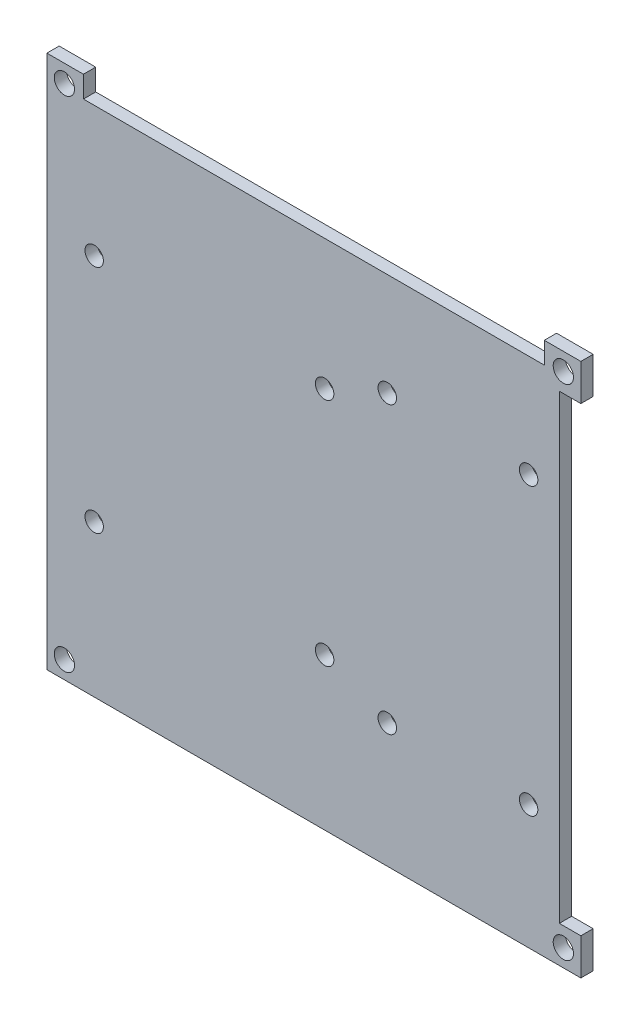
ISO-10303-21;
HEADER;
FILE_DESCRIPTION(('STEP AP214'),'2;1');
FILE_NAME('part.step','',(''),(''),'','','');
FILE_SCHEMA(('AUTOMOTIVE_DESIGN { 1 0 10303 214 1 1 1 1 }'));
ENDSEC;
DATA;
#1=APPLICATION_CONTEXT('core data for automotive mechanical design processes');
#2=APPLICATION_PROTOCOL_DEFINITION('international standard','automotive_design',2000,#1);
#3=PRODUCT_CONTEXT('',#1,'mechanical');
#4=PRODUCT('Part','Part','',(#3));
#5=PRODUCT_RELATED_PRODUCT_CATEGORY('part','',(#4));
#6=PRODUCT_DEFINITION_FORMATION('','',#4);
#7=PRODUCT_DEFINITION_CONTEXT('part definition',#1,'design');
#8=PRODUCT_DEFINITION('design','',#6,#7);
#9=PRODUCT_DEFINITION_SHAPE('','',#8);
#10=(LENGTH_UNIT() NAMED_UNIT(*) SI_UNIT(.MILLI.,.METRE.));
#11=(NAMED_UNIT(*) PLANE_ANGLE_UNIT() SI_UNIT($,.RADIAN.));
#12=(NAMED_UNIT(*) SI_UNIT($,.STERADIAN.) SOLID_ANGLE_UNIT());
#13=UNCERTAINTY_MEASURE_WITH_UNIT(LENGTH_MEASURE(1.E-05),#10,'distance_accuracy_value','');
#14=(GEOMETRIC_REPRESENTATION_CONTEXT(3) GLOBAL_UNCERTAINTY_ASSIGNED_CONTEXT((#13)) GLOBAL_UNIT_ASSIGNED_CONTEXT((#10,
#11,#12)) REPRESENTATION_CONTEXT('',''));
#15=CARTESIAN_POINT('',(0.,0.,0.));
#16=DIRECTION('',(0.,0.,1.));
#17=DIRECTION('',(1.,0.,0.));
#18=AXIS2_PLACEMENT_3D('',#15,#16,#17);
#19=CARTESIAN_POINT('',(0.,0.,2.));
#20=DIRECTION('',(-1.,0.,0.));
#21=DIRECTION('',(0.,0.,1.));
#22=AXIS2_PLACEMENT_3D('',#19,#20,#21);
#23=PLANE('',#22);
#24=DIRECTION('',(0.,0.,1.));
#25=VECTOR('',#24,1.);
#26=CARTESIAN_POINT('',(0.,80.95,0.));
#27=LINE('',#26,#25);
#28=CARTESIAN_POINT('',(0.,80.95,0.));
#29=VERTEX_POINT('',#28);
#30=CARTESIAN_POINT('',(0.,80.95,2.));
#31=VERTEX_POINT('',#30);
#32=EDGE_CURVE('E139',#29,#31,#27,.T.);
#33=ORIENTED_EDGE('',*,*,#32,.F.);
#34=DIRECTION('',(0.,1.,0.));
#35=VECTOR('',#34,1.);
#36=CARTESIAN_POINT('',(0.,0.,0.));
#37=LINE('',#36,#35);
#38=CARTESIAN_POINT('',(0.,86.9,0.));
#39=VERTEX_POINT('',#38);
#40=EDGE_CURVE('E153',#29,#39,#37,.T.);
#41=ORIENTED_EDGE('',*,*,#40,.T.);
#42=DIRECTION('',(0.,0.,-1.));
#43=VECTOR('',#42,1.);
#44=CARTESIAN_POINT('',(0.,86.9,2.));
#45=LINE('',#44,#43);
#46=CARTESIAN_POINT('',(0.,86.9,2.));
#47=VERTEX_POINT('',#46);
#48=EDGE_CURVE('E57',#47,#39,#45,.T.);
#49=ORIENTED_EDGE('',*,*,#48,.F.);
#50=DIRECTION('',(0.,1.,0.));
#51=VECTOR('',#50,1.);
#52=CARTESIAN_POINT('',(0.,0.,2.));
#53=LINE('',#52,#51);
#54=EDGE_CURVE('E154',#31,#47,#53,.T.);
#55=ORIENTED_EDGE('',*,*,#54,.F.);
#56=EDGE_LOOP('',(#33,#41,#49,#55));
#57=FACE_BOUND('',#56,.T.);
#58=ADVANCED_FACE('F50',(#57),#23,.F.);
#59=CARTESIAN_POINT('',(0.,86.9,2.));
#60=DIRECTION('',(0.,-1.,0.));
#61=DIRECTION('',(0.,0.,-1.));
#62=AXIS2_PLACEMENT_3D('',#59,#60,#61);
#63=PLANE('',#62);
#64=DIRECTION('',(0.,0.,1.));
#65=VECTOR('',#64,1.);
#66=CARTESIAN_POINT('',(-80.95,86.9,0.));
#67=LINE('',#66,#65);
#68=CARTESIAN_POINT('',(-80.95,86.9,0.));
#69=VERTEX_POINT('',#68);
#70=CARTESIAN_POINT('',(-80.95,86.9,2.));
#71=VERTEX_POINT('',#70);
#72=EDGE_CURVE('E262',#69,#71,#67,.T.);
#73=ORIENTED_EDGE('',*,*,#72,.F.);
#74=DIRECTION('',(-1.,0.,0.));
#75=VECTOR('',#74,1.);
#76=CARTESIAN_POINT('',(0.,86.9,0.));
#77=LINE('',#76,#75);
#78=CARTESIAN_POINT('',(-86.9,86.9,0.));
#79=VERTEX_POINT('',#78);
#80=EDGE_CURVE('E164',#69,#79,#77,.T.);
#81=ORIENTED_EDGE('',*,*,#80,.T.);
#82=DIRECTION('',(0.,0.,-1.));
#83=VECTOR('',#82,1.);
#84=CARTESIAN_POINT('',(-86.9,86.9,2.));
#85=LINE('',#84,#83);
#86=CARTESIAN_POINT('',(-86.9,86.9,2.));
#87=VERTEX_POINT('',#86);
#88=EDGE_CURVE('E168',#87,#79,#85,.T.);
#89=ORIENTED_EDGE('',*,*,#88,.F.);
#90=DIRECTION('',(-1.,0.,0.));
#91=VECTOR('',#90,1.);
#92=CARTESIAN_POINT('',(0.,86.9,2.));
#93=LINE('',#92,#91);
#94=EDGE_CURVE('E248',#71,#87,#93,.T.);
#95=ORIENTED_EDGE('',*,*,#94,.F.);
#96=EDGE_LOOP('',(#73,#81,#89,#95));
#97=FACE_BOUND('',#96,.T.);
#98=ADVANCED_FACE('F265',(#97),#63,.F.);
#99=CARTESIAN_POINT('',(0.,0.,2.));
#100=DIRECTION('',(0.,0.,-1.));
#101=DIRECTION('',(-1.,0.,0.));
#102=AXIS2_PLACEMENT_3D('',#99,#100,#101);
#103=PLANE('',#102);
#104=CARTESIAN_POINT('',(-31.5,20.2,2.));
#105=DIRECTION('',(0.,0.,1.));
#106=DIRECTION('',(1.,0.,0.));
#107=AXIS2_PLACEMENT_3D('',#104,#105,#106);
#108=CIRCLE('',#107,1.5);
#109=CARTESIAN_POINT('',(-30.,20.2,2.));
#110=VERTEX_POINT('',#109);
#111=EDGE_CURVE('E292',#110,#110,#108,.T.);
#112=ORIENTED_EDGE('',*,*,#111,.F.);
#113=EDGE_LOOP('',(#112));
#114=FACE_BOUND('',#113,.T.);
#115=CARTESIAN_POINT('',(-8.5,20.2,2.));
#116=DIRECTION('',(0.,0.,1.));
#117=DIRECTION('',(1.,0.,0.));
#118=AXIS2_PLACEMENT_3D('',#115,#116,#117);
#119=CIRCLE('',#118,1.5);
#120=CARTESIAN_POINT('',(-7.,20.2,2.));
#121=VERTEX_POINT('',#120);
#122=EDGE_CURVE('E319',#121,#121,#119,.T.);
#123=ORIENTED_EDGE('',*,*,#122,.F.);
#124=EDGE_LOOP('',(#123));
#125=FACE_BOUND('',#124,.T.);
#126=CARTESIAN_POINT('',(-8.5,66.7,2.));
#127=DIRECTION('',(0.,0.,1.));
#128=DIRECTION('',(1.,0.,0.));
#129=AXIS2_PLACEMENT_3D('',#126,#127,#128);
#130=CIRCLE('',#129,1.5);
#131=CARTESIAN_POINT('',(-7.,66.7,2.));
#132=VERTEX_POINT('',#131);
#133=EDGE_CURVE('E320',#132,#132,#130,.T.);
#134=ORIENTED_EDGE('',*,*,#133,.F.);
#135=EDGE_LOOP('',(#134));
#136=FACE_BOUND('',#135,.T.);
#137=CARTESIAN_POINT('',(-31.5,66.7,2.));
#138=DIRECTION('',(0.,0.,1.));
#139=DIRECTION('',(1.,0.,0.));
#140=AXIS2_PLACEMENT_3D('',#137,#138,#139);
#141=CIRCLE('',#140,1.5);
#142=CARTESIAN_POINT('',(-30.,66.7,2.));
#143=VERTEX_POINT('',#142);
#144=EDGE_CURVE('E192',#143,#143,#141,.T.);
#145=ORIENTED_EDGE('',*,*,#144,.F.);
#146=EDGE_LOOP('',(#145));
#147=FACE_BOUND('',#146,.T.);
#148=CARTESIAN_POINT('',(-41.7,24.7,2.));
#149=DIRECTION('',(0.,0.,1.));
#150=DIRECTION('',(1.,0.,0.));
#151=AXIS2_PLACEMENT_3D('',#148,#149,#150);
#152=CIRCLE('',#151,1.5);
#153=CARTESIAN_POINT('',(-40.2,24.7,2.));
#154=VERTEX_POINT('',#153);
#155=EDGE_CURVE('E209',#154,#154,#152,.T.);
#156=ORIENTED_EDGE('',*,*,#155,.F.);
#157=EDGE_LOOP('',(#156));
#158=FACE_BOUND('',#157,.T.);
#159=CARTESIAN_POINT('',(-79.2,62.2,2.));
#160=DIRECTION('',(0.,0.,1.));
#161=DIRECTION('',(1.,0.,0.));
#162=AXIS2_PLACEMENT_3D('',#159,#160,#161);
#163=CIRCLE('',#162,1.5);
#164=CARTESIAN_POINT('',(-77.7,62.2,2.));
#165=VERTEX_POINT('',#164);
#166=EDGE_CURVE('E202',#165,#165,#163,.T.);
#167=ORIENTED_EDGE('',*,*,#166,.F.);
#168=EDGE_LOOP('',(#167));
#169=FACE_BOUND('',#168,.T.);
#170=CARTESIAN_POINT('',(-79.2,24.7,2.));
#171=DIRECTION('',(0.,0.,1.));
#172=DIRECTION('',(1.,0.,0.));
#173=AXIS2_PLACEMENT_3D('',#170,#171,#172);
#174=CIRCLE('',#173,1.5);
#175=CARTESIAN_POINT('',(-77.7,24.7,2.));
#176=VERTEX_POINT('',#175);
#177=EDGE_CURVE('E203',#176,#176,#174,.T.);
#178=ORIENTED_EDGE('',*,*,#177,.F.);
#179=EDGE_LOOP('',(#178));
#180=FACE_BOUND('',#179,.T.);
#181=CARTESIAN_POINT('',(-41.7,62.2,2.));
#182=DIRECTION('',(0.,0.,1.));
#183=DIRECTION('',(1.,0.,0.));
#184=AXIS2_PLACEMENT_3D('',#181,#182,#183);
#185=CIRCLE('',#184,1.5);
#186=CARTESIAN_POINT('',(-40.2,62.2,2.));
#187=VERTEX_POINT('',#186);
#188=EDGE_CURVE('E179',#187,#187,#185,.T.);
#189=ORIENTED_EDGE('',*,*,#188,.F.);
#190=EDGE_LOOP('',(#189));
#191=FACE_BOUND('',#190,.T.);
#192=CARTESIAN_POINT('',(-84.05,84.05,2.));
#193=DIRECTION('',(0.,0.,1.));
#194=DIRECTION('',(1.,0.,0.));
#195=AXIS2_PLACEMENT_3D('',#192,#193,#194);
#196=CIRCLE('',#195,1.65);
#197=CARTESIAN_POINT('',(-82.4,84.05,2.));
#198=VERTEX_POINT('',#197);
#199=EDGE_CURVE('E235',#198,#198,#196,.T.);
#200=ORIENTED_EDGE('',*,*,#199,.F.);
#201=EDGE_LOOP('',(#200));
#202=FACE_BOUND('',#201,.T.);
#203=CARTESIAN_POINT('',(-2.84999999999997,84.05,2.));
#204=DIRECTION('',(0.,0.,1.));
#205=DIRECTION('',(1.,0.,0.));
#206=AXIS2_PLACEMENT_3D('',#203,#204,#205);
#207=CIRCLE('',#206,1.65);
#208=CARTESIAN_POINT('',(-1.19999999999997,84.05,2.));
#209=VERTEX_POINT('',#208);
#210=EDGE_CURVE('E228',#209,#209,#207,.T.);
#211=ORIENTED_EDGE('',*,*,#210,.F.);
#212=EDGE_LOOP('',(#211));
#213=FACE_BOUND('',#212,.T.);
#214=CARTESIAN_POINT('',(-2.85,2.84999999999999,2.));
#215=DIRECTION('',(0.,0.,1.));
#216=DIRECTION('',(1.,0.,0.));
#217=AXIS2_PLACEMENT_3D('',#214,#215,#216);
#218=CIRCLE('',#217,1.65);
#219=CARTESIAN_POINT('',(-1.2,2.84999999999999,2.));
#220=VERTEX_POINT('',#219);
#221=EDGE_CURVE('E218',#220,#220,#218,.T.);
#222=ORIENTED_EDGE('',*,*,#221,.F.);
#223=EDGE_LOOP('',(#222));
#224=FACE_BOUND('',#223,.T.);
#225=CARTESIAN_POINT('',(-84.05,2.85000000000001,2.));
#226=DIRECTION('',(0.,0.,1.));
#227=DIRECTION('',(1.,0.,0.));
#228=AXIS2_PLACEMENT_3D('',#225,#226,#227);
#229=CIRCLE('',#228,1.65);
#230=CARTESIAN_POINT('',(-82.4,2.85000000000001,2.));
#231=VERTEX_POINT('',#230);
#232=EDGE_CURVE('E225',#231,#231,#229,.T.);
#233=ORIENTED_EDGE('',*,*,#232,.F.);
#234=EDGE_LOOP('',(#233));
#235=FACE_BOUND('',#234,.T.);
#236=DIRECTION('',(-1.,0.,0.));
#237=VECTOR('',#236,1.);
#238=CARTESIAN_POINT('',(0.,80.95,2.));
#239=LINE('',#238,#237);
#240=CARTESIAN_POINT('',(-3.49999999999999,80.95,2.));
#241=VERTEX_POINT('',#240);
#242=EDGE_CURVE('E286',#31,#241,#239,.T.);
#243=ORIENTED_EDGE('',*,*,#242,.F.);
#244=ORIENTED_EDGE('',*,*,#54,.T.);
#245=CARTESIAN_POINT('',(-5.95,86.9,2.));
#246=VERTEX_POINT('',#245);
#247=EDGE_CURVE('E247',#47,#246,#93,.T.);
#248=ORIENTED_EDGE('',*,*,#247,.T.);
#249=DIRECTION('',(0.,1.,0.));
#250=VECTOR('',#249,1.);
#251=CARTESIAN_POINT('',(-5.95,86.9,2.));
#252=LINE('',#251,#250);
#253=CARTESIAN_POINT('',(-5.95,83.4,2.));
#254=VERTEX_POINT('',#253);
#255=EDGE_CURVE('E303',#254,#246,#252,.T.);
#256=ORIENTED_EDGE('',*,*,#255,.F.);
#257=DIRECTION('',(1.,0.,0.));
#258=VECTOR('',#257,1.);
#259=CARTESIAN_POINT('',(-5.95,83.4,2.));
#260=LINE('',#259,#258);
#261=CARTESIAN_POINT('',(-80.95,83.4,2.));
#262=VERTEX_POINT('',#261);
#263=EDGE_CURVE('E304',#262,#254,#260,.T.);
#264=ORIENTED_EDGE('',*,*,#263,.F.);
#265=DIRECTION('',(0.,-1.,0.));
#266=VECTOR('',#265,1.);
#267=CARTESIAN_POINT('',(-80.95,86.9,2.));
#268=LINE('',#267,#266);
#269=EDGE_CURVE('E310',#71,#262,#268,.T.);
#270=ORIENTED_EDGE('',*,*,#269,.F.);
#271=ORIENTED_EDGE('',*,*,#94,.T.);
#272=DIRECTION('',(0.,1.,0.));
#273=VECTOR('',#272,1.);
#274=CARTESIAN_POINT('',(-86.9,0.,2.));
#275=LINE('',#274,#273);
#276=CARTESIAN_POINT('',(-86.9,0.,2.));
#277=VERTEX_POINT('',#276);
#278=EDGE_CURVE('E242',#277,#87,#275,.T.);
#279=ORIENTED_EDGE('',*,*,#278,.F.);
#280=DIRECTION('',(-1.,0.,0.));
#281=VECTOR('',#280,1.);
#282=CARTESIAN_POINT('',(0.,0.,2.));
#283=LINE('',#282,#281);
#284=CARTESIAN_POINT('',(0.,0.,2.));
#285=VERTEX_POINT('',#284);
#286=EDGE_CURVE('E163',#285,#277,#283,.T.);
#287=ORIENTED_EDGE('',*,*,#286,.F.);
#288=CARTESIAN_POINT('',(0.,5.95,2.));
#289=VERTEX_POINT('',#288);
#290=EDGE_CURVE('E172',#285,#289,#53,.T.);
#291=ORIENTED_EDGE('',*,*,#290,.T.);
#292=DIRECTION('',(1.,0.,0.));
#293=VECTOR('',#292,1.);
#294=CARTESIAN_POINT('',(0.,5.95,2.));
#295=LINE('',#294,#293);
#296=CARTESIAN_POINT('',(-3.49999999999998,5.95,2.));
#297=VERTEX_POINT('',#296);
#298=EDGE_CURVE('E146',#297,#289,#295,.T.);
#299=ORIENTED_EDGE('',*,*,#298,.F.);
#300=DIRECTION('',(0.,-1.,0.));
#301=VECTOR('',#300,1.);
#302=CARTESIAN_POINT('',(-3.49999999999999,80.95,2.));
#303=LINE('',#302,#301);
#304=EDGE_CURVE('E284',#241,#297,#303,.T.);
#305=ORIENTED_EDGE('',*,*,#304,.F.);
#306=EDGE_LOOP('',(#243,#244,#248,#256,#264,#270,#271,#279,#287,#291,#299,#305));
#307=FACE_BOUND('',#306,.T.);
#308=ADVANCED_FACE('F271',(#114,#125,#136,#147,#158,#169,#180,#191,#202,#213,#224,#235,#307),
#103,.F.);
#309=CARTESIAN_POINT('',(0.,0.,0.));
#310=DIRECTION('',(0.,0.,-1.));
#311=DIRECTION('',(-1.,0.,0.));
#312=AXIS2_PLACEMENT_3D('',#309,#310,#311);
#313=PLANE('',#312);
#314=CARTESIAN_POINT('',(-31.5,20.2,0.));
#315=DIRECTION('',(0.,0.,-1.));
#316=DIRECTION('',(-1.,0.,0.));
#317=AXIS2_PLACEMENT_3D('',#314,#315,#316);
#318=CIRCLE('',#317,1.5);
#319=CARTESIAN_POINT('',(-33.,20.2,0.));
#320=VERTEX_POINT('',#319);
#321=EDGE_CURVE('E51',#320,#320,#318,.T.);
#322=ORIENTED_EDGE('',*,*,#321,.F.);
#323=EDGE_LOOP('',(#322));
#324=FACE_BOUND('',#323,.T.);
#325=CARTESIAN_POINT('',(-8.5,20.2,0.));
#326=DIRECTION('',(0.,0.,-1.));
#327=DIRECTION('',(-1.,0.,0.));
#328=AXIS2_PLACEMENT_3D('',#325,#326,#327);
#329=CIRCLE('',#328,1.5);
#330=CARTESIAN_POINT('',(-10.,20.2,0.));
#331=VERTEX_POINT('',#330);
#332=EDGE_CURVE('E198',#331,#331,#329,.T.);
#333=ORIENTED_EDGE('',*,*,#332,.F.);
#334=EDGE_LOOP('',(#333));
#335=FACE_BOUND('',#334,.T.);
#336=CARTESIAN_POINT('',(-8.5,66.7,0.));
#337=DIRECTION('',(0.,0.,-1.));
#338=DIRECTION('',(-1.,0.,0.));
#339=AXIS2_PLACEMENT_3D('',#336,#337,#338);
#340=CIRCLE('',#339,1.5);
#341=CARTESIAN_POINT('',(-10.,66.7,0.));
#342=VERTEX_POINT('',#341);
#343=EDGE_CURVE('E193',#342,#342,#340,.T.);
#344=ORIENTED_EDGE('',*,*,#343,.F.);
#345=EDGE_LOOP('',(#344));
#346=FACE_BOUND('',#345,.T.);
#347=CARTESIAN_POINT('',(-31.5,66.7,0.));
#348=DIRECTION('',(0.,0.,-1.));
#349=DIRECTION('',(-1.,0.,0.));
#350=AXIS2_PLACEMENT_3D('',#347,#348,#349);
#351=CIRCLE('',#350,1.5);
#352=CARTESIAN_POINT('',(-33.,66.7,0.));
#353=VERTEX_POINT('',#352);
#354=EDGE_CURVE('E187',#353,#353,#351,.T.);
#355=ORIENTED_EDGE('',*,*,#354,.F.);
#356=EDGE_LOOP('',(#355));
#357=FACE_BOUND('',#356,.T.);
#358=CARTESIAN_POINT('',(-41.7,24.7,0.));
#359=DIRECTION('',(0.,0.,-1.));
#360=DIRECTION('',(-1.,0.,0.));
#361=AXIS2_PLACEMENT_3D('',#358,#359,#360);
#362=CIRCLE('',#361,1.5);
#363=CARTESIAN_POINT('',(-43.2,24.7,0.));
#364=VERTEX_POINT('',#363);
#365=EDGE_CURVE('E188',#364,#364,#362,.T.);
#366=ORIENTED_EDGE('',*,*,#365,.F.);
#367=EDGE_LOOP('',(#366));
#368=FACE_BOUND('',#367,.T.);
#369=CARTESIAN_POINT('',(-79.2,62.2,0.));
#370=DIRECTION('',(0.,0.,-1.));
#371=DIRECTION('',(-1.,0.,0.));
#372=AXIS2_PLACEMENT_3D('',#369,#370,#371);
#373=CIRCLE('',#372,1.5);
#374=CARTESIAN_POINT('',(-80.7,62.2,0.));
#375=VERTEX_POINT('',#374);
#376=EDGE_CURVE('E181',#375,#375,#373,.T.);
#377=ORIENTED_EDGE('',*,*,#376,.F.);
#378=EDGE_LOOP('',(#377));
#379=FACE_BOUND('',#378,.T.);
#380=CARTESIAN_POINT('',(-79.2,24.7,0.));
#381=DIRECTION('',(0.,0.,-1.));
#382=DIRECTION('',(-1.,0.,0.));
#383=AXIS2_PLACEMENT_3D('',#380,#381,#382);
#384=CIRCLE('',#383,1.5);
#385=CARTESIAN_POINT('',(-80.7,24.7,0.));
#386=VERTEX_POINT('',#385);
#387=EDGE_CURVE('E177',#386,#386,#384,.T.);
#388=ORIENTED_EDGE('',*,*,#387,.F.);
#389=EDGE_LOOP('',(#388));
#390=FACE_BOUND('',#389,.T.);
#391=CARTESIAN_POINT('',(-41.7,62.2,0.));
#392=DIRECTION('',(0.,0.,-1.));
#393=DIRECTION('',(-1.,0.,0.));
#394=AXIS2_PLACEMENT_3D('',#391,#392,#393);
#395=CIRCLE('',#394,1.5);
#396=CARTESIAN_POINT('',(-43.2,62.2,0.));
#397=VERTEX_POINT('',#396);
#398=EDGE_CURVE('E176',#397,#397,#395,.T.);
#399=ORIENTED_EDGE('',*,*,#398,.F.);
#400=EDGE_LOOP('',(#399));
#401=FACE_BOUND('',#400,.T.);
#402=CARTESIAN_POINT('',(-84.05,84.05,0.));
#403=DIRECTION('',(0.,0.,1.));
#404=DIRECTION('',(1.,0.,0.));
#405=AXIS2_PLACEMENT_3D('',#402,#403,#404);
#406=CIRCLE('',#405,1.65);
#407=CARTESIAN_POINT('',(-82.4,84.05,0.));
#408=VERTEX_POINT('',#407);
#409=EDGE_CURVE('E189',#408,#408,#406,.T.);
#410=ORIENTED_EDGE('',*,*,#409,.T.);
#411=EDGE_LOOP('',(#410));
#412=FACE_BOUND('',#411,.T.);
#413=CARTESIAN_POINT('',(-2.84999999999997,84.05,0.));
#414=DIRECTION('',(0.,0.,1.));
#415=DIRECTION('',(1.,0.,0.));
#416=AXIS2_PLACEMENT_3D('',#413,#414,#415);
#417=CIRCLE('',#416,1.65);
#418=CARTESIAN_POINT('',(-1.19999999999997,84.05,0.));
#419=VERTEX_POINT('',#418);
#420=EDGE_CURVE('E229',#419,#419,#417,.T.);
#421=ORIENTED_EDGE('',*,*,#420,.T.);
#422=EDGE_LOOP('',(#421));
#423=FACE_BOUND('',#422,.T.);
#424=CARTESIAN_POINT('',(-2.85,2.84999999999999,0.));
#425=DIRECTION('',(0.,0.,1.));
#426=DIRECTION('',(1.,0.,0.));
#427=AXIS2_PLACEMENT_3D('',#424,#425,#426);
#428=CIRCLE('',#427,1.65);
#429=CARTESIAN_POINT('',(-1.2,2.84999999999999,0.));
#430=VERTEX_POINT('',#429);
#431=EDGE_CURVE('E224',#430,#430,#428,.T.);
#432=ORIENTED_EDGE('',*,*,#431,.T.);
#433=EDGE_LOOP('',(#432));
#434=FACE_BOUND('',#433,.T.);
#435=CARTESIAN_POINT('',(-84.05,2.85000000000001,0.));
#436=DIRECTION('',(0.,0.,1.));
#437=DIRECTION('',(1.,0.,0.));
#438=AXIS2_PLACEMENT_3D('',#435,#436,#437);
#439=CIRCLE('',#438,1.65);
#440=CARTESIAN_POINT('',(-82.4,2.85000000000001,0.));
#441=VERTEX_POINT('',#440);
#442=EDGE_CURVE('E240',#441,#441,#439,.T.);
#443=ORIENTED_EDGE('',*,*,#442,.T.);
#444=EDGE_LOOP('',(#443));
#445=FACE_BOUND('',#444,.T.);
#446=DIRECTION('',(0.,-1.,0.));
#447=VECTOR('',#446,1.);
#448=CARTESIAN_POINT('',(-3.49999999999999,80.95,0.));
#449=LINE('',#448,#447);
#450=CARTESIAN_POINT('',(-3.49999999999999,80.95,0.));
#451=VERTEX_POINT('',#450);
#452=CARTESIAN_POINT('',(-3.49999999999998,5.95,0.));
#453=VERTEX_POINT('',#452);
#454=EDGE_CURVE('E150',#451,#453,#449,.T.);
#455=ORIENTED_EDGE('',*,*,#454,.T.);
#456=DIRECTION('',(1.,0.,0.));
#457=VECTOR('',#456,1.);
#458=CARTESIAN_POINT('',(0.,5.95,0.));
#459=LINE('',#458,#457);
#460=CARTESIAN_POINT('',(0.,5.95,0.));
#461=VERTEX_POINT('',#460);
#462=EDGE_CURVE('E64',#453,#461,#459,.T.);
#463=ORIENTED_EDGE('',*,*,#462,.T.);
#464=CARTESIAN_POINT('',(0.,0.,0.));
#465=VERTEX_POINT('',#464);
#466=EDGE_CURVE('E161',#465,#461,#37,.T.);
#467=ORIENTED_EDGE('',*,*,#466,.F.);
#468=DIRECTION('',(-1.,0.,0.));
#469=VECTOR('',#468,1.);
#470=CARTESIAN_POINT('',(0.,0.,0.));
#471=LINE('',#470,#469);
#472=CARTESIAN_POINT('',(-86.9,0.,0.));
#473=VERTEX_POINT('',#472);
#474=EDGE_CURVE('E238',#465,#473,#471,.T.);
#475=ORIENTED_EDGE('',*,*,#474,.T.);
#476=DIRECTION('',(0.,1.,0.));
#477=VECTOR('',#476,1.);
#478=CARTESIAN_POINT('',(-86.9,0.,0.));
#479=LINE('',#478,#477);
#480=EDGE_CURVE('E254',#473,#79,#479,.T.);
#481=ORIENTED_EDGE('',*,*,#480,.T.);
#482=ORIENTED_EDGE('',*,*,#80,.F.);
#483=DIRECTION('',(0.,-1.,0.));
#484=VECTOR('',#483,1.);
#485=CARTESIAN_POINT('',(-80.95,86.9,0.));
#486=LINE('',#485,#484);
#487=CARTESIAN_POINT('',(-80.95,83.4,0.));
#488=VERTEX_POINT('',#487);
#489=EDGE_CURVE('E308',#69,#488,#486,.T.);
#490=ORIENTED_EDGE('',*,*,#489,.T.);
#491=DIRECTION('',(1.,0.,0.));
#492=VECTOR('',#491,1.);
#493=CARTESIAN_POINT('',(-5.95,83.4,0.));
#494=LINE('',#493,#492);
#495=CARTESIAN_POINT('',(-5.95,83.4,0.));
#496=VERTEX_POINT('',#495);
#497=EDGE_CURVE('E311',#488,#496,#494,.T.);
#498=ORIENTED_EDGE('',*,*,#497,.T.);
#499=DIRECTION('',(0.,1.,0.));
#500=VECTOR('',#499,1.);
#501=CARTESIAN_POINT('',(-5.95,86.9,0.));
#502=LINE('',#501,#500);
#503=CARTESIAN_POINT('',(-5.95,86.9,0.));
#504=VERTEX_POINT('',#503);
#505=EDGE_CURVE('E75',#496,#504,#502,.T.);
#506=ORIENTED_EDGE('',*,*,#505,.T.);
#507=EDGE_CURVE('E159',#39,#504,#77,.T.);
#508=ORIENTED_EDGE('',*,*,#507,.F.);
#509=ORIENTED_EDGE('',*,*,#40,.F.);
#510=DIRECTION('',(-1.,0.,0.));
#511=VECTOR('',#510,1.);
#512=CARTESIAN_POINT('',(0.,80.95,0.));
#513=LINE('',#512,#511);
#514=EDGE_CURVE('E136',#29,#451,#513,.T.);
#515=ORIENTED_EDGE('',*,*,#514,.T.);
#516=EDGE_LOOP('',(#455,#463,#467,#475,#481,#482,#490,#498,#506,#508,#509,#515));
#517=FACE_BOUND('',#516,.T.);
#518=ADVANCED_FACE('F158',(#324,#335,#346,#357,#368,#379,#390,#401,#412,#423,#434,#445,#517),
#313,.T.);
#519=CARTESIAN_POINT('',(0.,0.,2.));
#520=DIRECTION('',(0.,-1.,0.));
#521=DIRECTION('',(0.,0.,-1.));
#522=AXIS2_PLACEMENT_3D('',#519,#520,#521);
#523=PLANE('',#522);
#524=ORIENTED_EDGE('',*,*,#474,.F.);
#525=DIRECTION('',(0.,0.,-1.));
#526=VECTOR('',#525,1.);
#527=CARTESIAN_POINT('',(0.,0.,2.));
#528=LINE('',#527,#526);
#529=EDGE_CURVE('E11',#285,#465,#528,.T.);
#530=ORIENTED_EDGE('',*,*,#529,.F.);
#531=ORIENTED_EDGE('',*,*,#286,.T.);
#532=DIRECTION('',(0.,0.,-1.));
#533=VECTOR('',#532,1.);
#534=CARTESIAN_POINT('',(-86.9,0.,2.));
#535=LINE('',#534,#533);
#536=EDGE_CURVE('E171',#277,#473,#535,.T.);
#537=ORIENTED_EDGE('',*,*,#536,.T.);
#538=EDGE_LOOP('',(#524,#530,#531,#537));
#539=FACE_BOUND('',#538,.T.);
#540=ADVANCED_FACE('F47',(#539),#523,.T.);
#541=ORIENTED_EDGE('',*,*,#466,.T.);
#542=DIRECTION('',(0.,0.,1.));
#543=VECTOR('',#542,1.);
#544=CARTESIAN_POINT('',(0.,5.95,0.));
#545=LINE('',#544,#543);
#546=EDGE_CURVE('E278',#461,#289,#545,.T.);
#547=ORIENTED_EDGE('',*,*,#546,.T.);
#548=ORIENTED_EDGE('',*,*,#290,.F.);
#549=ORIENTED_EDGE('',*,*,#529,.T.);
#550=EDGE_LOOP('',(#541,#547,#548,#549));
#551=FACE_BOUND('',#550,.T.);
#552=ADVANCED_FACE('F276',(#551),#23,.F.);
#553=ORIENTED_EDGE('',*,*,#507,.T.);
#554=DIRECTION('',(0.,0.,1.));
#555=VECTOR('',#554,1.);
#556=CARTESIAN_POINT('',(-5.95,86.9,0.));
#557=LINE('',#556,#555);
#558=EDGE_CURVE('E297',#504,#246,#557,.T.);
#559=ORIENTED_EDGE('',*,*,#558,.T.);
#560=ORIENTED_EDGE('',*,*,#247,.F.);
#561=ORIENTED_EDGE('',*,*,#48,.T.);
#562=EDGE_LOOP('',(#553,#559,#560,#561));
#563=FACE_BOUND('',#562,.T.);
#564=ADVANCED_FACE('F365',(#563),#63,.F.);
#565=CARTESIAN_POINT('',(-86.9,0.,2.));
#566=DIRECTION('',(-1.,0.,0.));
#567=DIRECTION('',(0.,0.,1.));
#568=AXIS2_PLACEMENT_3D('',#565,#566,#567);
#569=PLANE('',#568);
#570=ORIENTED_EDGE('',*,*,#480,.F.);
#571=ORIENTED_EDGE('',*,*,#536,.F.);
#572=ORIENTED_EDGE('',*,*,#278,.T.);
#573=ORIENTED_EDGE('',*,*,#88,.T.);
#574=EDGE_LOOP('',(#570,#571,#572,#573));
#575=FACE_BOUND('',#574,.T.);
#576=ADVANCED_FACE('F270',(#575),#569,.T.);
#577=CARTESIAN_POINT('',(-84.05,2.85000000000001,0.));
#578=DIRECTION('',(0.,0.,1.));
#579=DIRECTION('',(1.,0.,0.));
#580=AXIS2_PLACEMENT_3D('',#577,#578,#579);
#581=CYLINDRICAL_SURFACE('',#580,1.65);
#582=ORIENTED_EDGE('',*,*,#442,.F.);
#583=EDGE_LOOP('',(#582));
#584=FACE_BOUND('',#583,.T.);
#585=ORIENTED_EDGE('',*,*,#232,.T.);
#586=EDGE_LOOP('',(#585));
#587=FACE_BOUND('',#586,.T.);
#588=ADVANCED_FACE('F355',(#584,#587),#581,.F.);
#589=CARTESIAN_POINT('',(-2.85,2.84999999999999,0.));
#590=DIRECTION('',(0.,0.,1.));
#591=DIRECTION('',(1.,0.,0.));
#592=AXIS2_PLACEMENT_3D('',#589,#590,#591);
#593=CYLINDRICAL_SURFACE('',#592,1.65);
#594=ORIENTED_EDGE('',*,*,#431,.F.);
#595=EDGE_LOOP('',(#594));
#596=FACE_BOUND('',#595,.T.);
#597=ORIENTED_EDGE('',*,*,#221,.T.);
#598=EDGE_LOOP('',(#597));
#599=FACE_BOUND('',#598,.T.);
#600=ADVANCED_FACE('F354',(#596,#599),#593,.F.);
#601=CARTESIAN_POINT('',(-2.84999999999997,84.05,0.));
#602=DIRECTION('',(0.,0.,1.));
#603=DIRECTION('',(1.,0.,0.));
#604=AXIS2_PLACEMENT_3D('',#601,#602,#603);
#605=CYLINDRICAL_SURFACE('',#604,1.65);
#606=ORIENTED_EDGE('',*,*,#420,.F.);
#607=EDGE_LOOP('',(#606));
#608=FACE_BOUND('',#607,.T.);
#609=ORIENTED_EDGE('',*,*,#210,.T.);
#610=EDGE_LOOP('',(#609));
#611=FACE_BOUND('',#610,.T.);
#612=ADVANCED_FACE('F363',(#608,#611),#605,.F.);
#613=CARTESIAN_POINT('',(-84.05,84.05,0.));
#614=DIRECTION('',(0.,0.,1.));
#615=DIRECTION('',(1.,0.,0.));
#616=AXIS2_PLACEMENT_3D('',#613,#614,#615);
#617=CYLINDRICAL_SURFACE('',#616,1.65);
#618=ORIENTED_EDGE('',*,*,#409,.F.);
#619=EDGE_LOOP('',(#618));
#620=FACE_BOUND('',#619,.T.);
#621=ORIENTED_EDGE('',*,*,#199,.T.);
#622=EDGE_LOOP('',(#621));
#623=FACE_BOUND('',#622,.T.);
#624=ADVANCED_FACE('F411',(#620,#623),#617,.F.);
#625=CARTESIAN_POINT('',(-41.7,62.2,-8.));
#626=DIRECTION('',(0.,0.,1.));
#627=DIRECTION('',(1.,0.,0.));
#628=AXIS2_PLACEMENT_3D('',#625,#626,#627);
#629=CYLINDRICAL_SURFACE('',#628,1.5);
#630=ORIENTED_EDGE('',*,*,#398,.T.);
#631=EDGE_LOOP('',(#630));
#632=FACE_BOUND('',#631,.T.);
#633=ORIENTED_EDGE('',*,*,#188,.T.);
#634=EDGE_LOOP('',(#633));
#635=FACE_BOUND('',#634,.T.);
#636=ADVANCED_FACE('F418',(#632,#635),#629,.F.);
#637=CARTESIAN_POINT('',(-79.2,24.7,-8.));
#638=DIRECTION('',(0.,0.,1.));
#639=DIRECTION('',(1.,0.,0.));
#640=AXIS2_PLACEMENT_3D('',#637,#638,#639);
#641=CYLINDRICAL_SURFACE('',#640,1.5);
#642=ORIENTED_EDGE('',*,*,#387,.T.);
#643=EDGE_LOOP('',(#642));
#644=FACE_BOUND('',#643,.T.);
#645=ORIENTED_EDGE('',*,*,#177,.T.);
#646=EDGE_LOOP('',(#645));
#647=FACE_BOUND('',#646,.T.);
#648=ADVANCED_FACE('F423',(#644,#647),#641,.F.);
#649=CARTESIAN_POINT('',(-79.2,62.2,-8.));
#650=DIRECTION('',(0.,0.,1.));
#651=DIRECTION('',(1.,0.,0.));
#652=AXIS2_PLACEMENT_3D('',#649,#650,#651);
#653=CYLINDRICAL_SURFACE('',#652,1.5);
#654=ORIENTED_EDGE('',*,*,#376,.T.);
#655=EDGE_LOOP('',(#654));
#656=FACE_BOUND('',#655,.T.);
#657=ORIENTED_EDGE('',*,*,#166,.T.);
#658=EDGE_LOOP('',(#657));
#659=FACE_BOUND('',#658,.T.);
#660=ADVANCED_FACE('F421',(#656,#659),#653,.F.);
#661=CARTESIAN_POINT('',(-41.7,24.7,-8.));
#662=DIRECTION('',(0.,0.,1.));
#663=DIRECTION('',(1.,0.,0.));
#664=AXIS2_PLACEMENT_3D('',#661,#662,#663);
#665=CYLINDRICAL_SURFACE('',#664,1.5);
#666=ORIENTED_EDGE('',*,*,#365,.T.);
#667=EDGE_LOOP('',(#666));
#668=FACE_BOUND('',#667,.T.);
#669=ORIENTED_EDGE('',*,*,#155,.T.);
#670=EDGE_LOOP('',(#669));
#671=FACE_BOUND('',#670,.T.);
#672=ADVANCED_FACE('F426',(#668,#671),#665,.F.);
#673=CARTESIAN_POINT('',(-31.5,66.7,-8.));
#674=DIRECTION('',(0.,0.,1.));
#675=DIRECTION('',(1.,0.,0.));
#676=AXIS2_PLACEMENT_3D('',#673,#674,#675);
#677=CYLINDRICAL_SURFACE('',#676,1.5);
#678=ORIENTED_EDGE('',*,*,#354,.T.);
#679=EDGE_LOOP('',(#678));
#680=FACE_BOUND('',#679,.T.);
#681=ORIENTED_EDGE('',*,*,#144,.T.);
#682=EDGE_LOOP('',(#681));
#683=FACE_BOUND('',#682,.T.);
#684=ADVANCED_FACE('F429',(#680,#683),#677,.F.);
#685=CARTESIAN_POINT('',(-8.5,66.7,-8.));
#686=DIRECTION('',(0.,0.,1.));
#687=DIRECTION('',(1.,0.,0.));
#688=AXIS2_PLACEMENT_3D('',#685,#686,#687);
#689=CYLINDRICAL_SURFACE('',#688,1.5);
#690=ORIENTED_EDGE('',*,*,#343,.T.);
#691=EDGE_LOOP('',(#690));
#692=FACE_BOUND('',#691,.T.);
#693=ORIENTED_EDGE('',*,*,#133,.T.);
#694=EDGE_LOOP('',(#693));
#695=FACE_BOUND('',#694,.T.);
#696=ADVANCED_FACE('F440',(#692,#695),#689,.F.);
#697=CARTESIAN_POINT('',(-8.5,20.2,-8.));
#698=DIRECTION('',(0.,0.,1.));
#699=DIRECTION('',(1.,0.,0.));
#700=AXIS2_PLACEMENT_3D('',#697,#698,#699);
#701=CYLINDRICAL_SURFACE('',#700,1.5);
#702=ORIENTED_EDGE('',*,*,#332,.T.);
#703=EDGE_LOOP('',(#702));
#704=FACE_BOUND('',#703,.T.);
#705=ORIENTED_EDGE('',*,*,#122,.T.);
#706=EDGE_LOOP('',(#705));
#707=FACE_BOUND('',#706,.T.);
#708=ADVANCED_FACE('F442',(#704,#707),#701,.F.);
#709=CARTESIAN_POINT('',(-31.5,20.2,-8.));
#710=DIRECTION('',(0.,0.,1.));
#711=DIRECTION('',(1.,0.,0.));
#712=AXIS2_PLACEMENT_3D('',#709,#710,#711);
#713=CYLINDRICAL_SURFACE('',#712,1.5);
#714=ORIENTED_EDGE('',*,*,#321,.T.);
#715=EDGE_LOOP('',(#714));
#716=FACE_BOUND('',#715,.T.);
#717=ORIENTED_EDGE('',*,*,#111,.T.);
#718=EDGE_LOOP('',(#717));
#719=FACE_BOUND('',#718,.T.);
#720=ADVANCED_FACE('F324',(#716,#719),#713,.F.);
#721=CARTESIAN_POINT('',(-5.95,86.9,0.));
#722=DIRECTION('',(1.,0.,0.));
#723=DIRECTION('',(0.,1.,0.));
#724=AXIS2_PLACEMENT_3D('',#721,#722,#723);
#725=PLANE('',#724);
#726=ORIENTED_EDGE('',*,*,#255,.T.);
#727=ORIENTED_EDGE('',*,*,#558,.F.);
#728=ORIENTED_EDGE('',*,*,#505,.F.);
#729=DIRECTION('',(0.,0.,1.));
#730=VECTOR('',#729,1.);
#731=CARTESIAN_POINT('',(-5.95,83.4,0.));
#732=LINE('',#731,#730);
#733=EDGE_CURVE('E296',#496,#254,#732,.T.);
#734=ORIENTED_EDGE('',*,*,#733,.T.);
#735=EDGE_LOOP('',(#726,#727,#728,#734));
#736=FACE_BOUND('',#735,.T.);
#737=ADVANCED_FACE('F439',(#736),#725,.F.);
#738=CARTESIAN_POINT('',(-5.95,83.4,0.));
#739=DIRECTION('',(0.,-1.,0.));
#740=DIRECTION('',(1.,0.,0.));
#741=AXIS2_PLACEMENT_3D('',#738,#739,#740);
#742=PLANE('',#741);
#743=ORIENTED_EDGE('',*,*,#263,.T.);
#744=ORIENTED_EDGE('',*,*,#733,.F.);
#745=ORIENTED_EDGE('',*,*,#497,.F.);
#746=DIRECTION('',(0.,0.,1.));
#747=VECTOR('',#746,1.);
#748=CARTESIAN_POINT('',(-80.95,83.4,0.));
#749=LINE('',#748,#747);
#750=EDGE_CURVE('E298',#488,#262,#749,.T.);
#751=ORIENTED_EDGE('',*,*,#750,.T.);
#752=EDGE_LOOP('',(#743,#744,#745,#751));
#753=FACE_BOUND('',#752,.T.);
#754=ADVANCED_FACE('F449',(#753),#742,.F.);
#755=CARTESIAN_POINT('',(-80.95,86.9,0.));
#756=DIRECTION('',(-1.,0.,0.));
#757=DIRECTION('',(0.,0.,1.));
#758=AXIS2_PLACEMENT_3D('',#755,#756,#757);
#759=PLANE('',#758);
#760=ORIENTED_EDGE('',*,*,#269,.T.);
#761=ORIENTED_EDGE('',*,*,#750,.F.);
#762=ORIENTED_EDGE('',*,*,#489,.F.);
#763=ORIENTED_EDGE('',*,*,#72,.T.);
#764=EDGE_LOOP('',(#760,#761,#762,#763));
#765=FACE_BOUND('',#764,.T.);
#766=ADVANCED_FACE('F455',(#765),#759,.F.);
#767=CARTESIAN_POINT('',(0.,5.95,0.));
#768=DIRECTION('',(0.,-1.,0.));
#769=DIRECTION('',(0.,0.,-1.));
#770=AXIS2_PLACEMENT_3D('',#767,#768,#769);
#771=PLANE('',#770);
#772=ORIENTED_EDGE('',*,*,#298,.T.);
#773=ORIENTED_EDGE('',*,*,#546,.F.);
#774=ORIENTED_EDGE('',*,*,#462,.F.);
#775=DIRECTION('',(0.,0.,1.));
#776=VECTOR('',#775,1.);
#777=CARTESIAN_POINT('',(-3.49999999999998,5.95,0.));
#778=LINE('',#777,#776);
#779=EDGE_CURVE('E295',#453,#297,#778,.T.);
#780=ORIENTED_EDGE('',*,*,#779,.T.);
#781=EDGE_LOOP('',(#772,#773,#774,#780));
#782=FACE_BOUND('',#781,.T.);
#783=ADVANCED_FACE('F457',(#782),#771,.F.);
#784=CARTESIAN_POINT('',(-3.49999999999999,80.95,0.));
#785=DIRECTION('',(-1.,0.,0.));
#786=DIRECTION('',(0.,-1.,0.));
#787=AXIS2_PLACEMENT_3D('',#784,#785,#786);
#788=PLANE('',#787);
#789=ORIENTED_EDGE('',*,*,#304,.T.);
#790=ORIENTED_EDGE('',*,*,#779,.F.);
#791=ORIENTED_EDGE('',*,*,#454,.F.);
#792=DIRECTION('',(0.,0.,1.));
#793=VECTOR('',#792,1.);
#794=CARTESIAN_POINT('',(-3.49999999999999,80.95,0.));
#795=LINE('',#794,#793);
#796=EDGE_CURVE('E142',#451,#241,#795,.T.);
#797=ORIENTED_EDGE('',*,*,#796,.T.);
#798=EDGE_LOOP('',(#789,#790,#791,#797));
#799=FACE_BOUND('',#798,.T.);
#800=ADVANCED_FACE('F458',(#799),#788,.F.);
#801=CARTESIAN_POINT('',(0.,80.95,0.));
#802=DIRECTION('',(0.,1.,0.));
#803=DIRECTION('',(0.,0.,1.));
#804=AXIS2_PLACEMENT_3D('',#801,#802,#803);
#805=PLANE('',#804);
#806=ORIENTED_EDGE('',*,*,#242,.T.);
#807=ORIENTED_EDGE('',*,*,#796,.F.);
#808=ORIENTED_EDGE('',*,*,#514,.F.);
#809=ORIENTED_EDGE('',*,*,#32,.T.);
#810=EDGE_LOOP('',(#806,#807,#808,#809));
#811=FACE_BOUND('',#810,.T.);
#812=ADVANCED_FACE('F137',(#811),#805,.F.);
#813=CLOSED_SHELL('',(#58,#98,#308,#518,#540,#552,#564,#576,#588,#600,#612,#624,#636,#648,#660,
#672,#684,#696,#708,#720,#737,#754,#766,#783,#800,#812));
#814=MANIFOLD_SOLID_BREP('B2',#813);
#815=ADVANCED_BREP_SHAPE_REPRESENTATION('',(#18,#814),#14);
#816=SHAPE_DEFINITION_REPRESENTATION(#9,#815);
ENDSEC;
END-ISO-10303-21;
